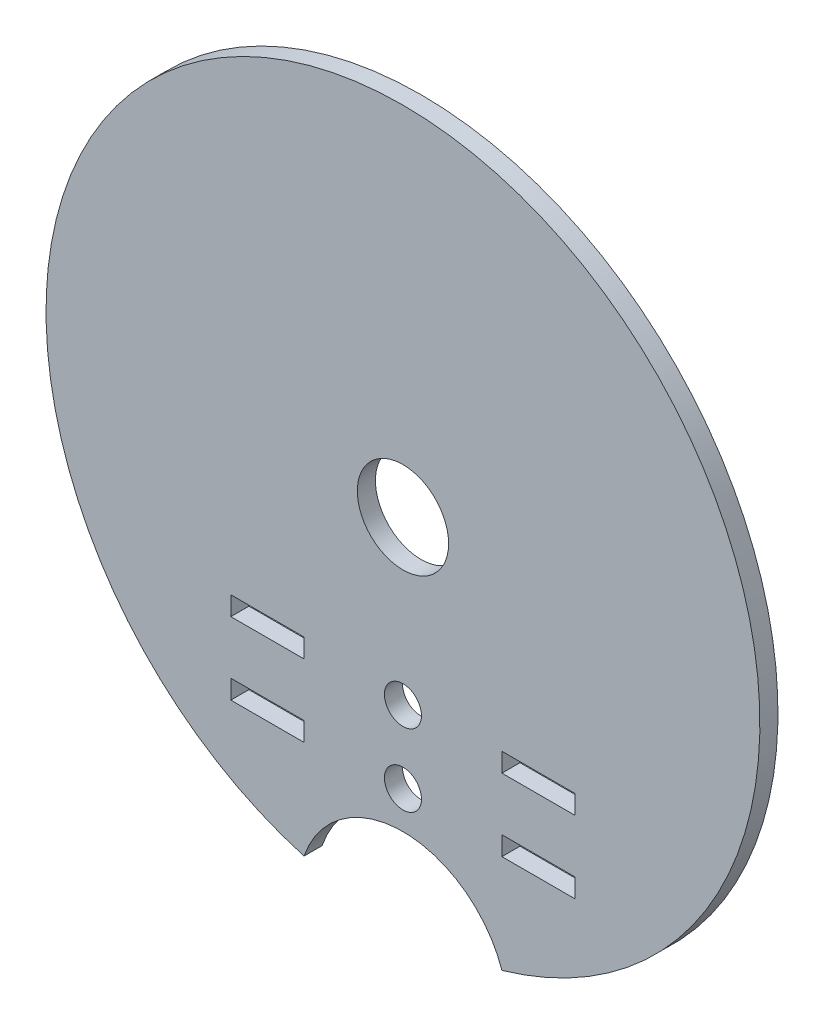
ISO-10303-21;
HEADER;
FILE_DESCRIPTION(('STEP AP214'),'2;1');
FILE_NAME('part.step','',(''),(''),'','','');
FILE_SCHEMA(('AUTOMOTIVE_DESIGN { 1 0 10303 214 1 1 1 1 }'));
ENDSEC;
DATA;
#1=APPLICATION_CONTEXT('core data for automotive mechanical design processes');
#2=APPLICATION_PROTOCOL_DEFINITION('international standard','automotive_design',2000,#1);
#3=PRODUCT_CONTEXT('',#1,'mechanical');
#4=PRODUCT('Part','Part','',(#3));
#5=PRODUCT_RELATED_PRODUCT_CATEGORY('part','',(#4));
#6=PRODUCT_DEFINITION_FORMATION('','',#4);
#7=PRODUCT_DEFINITION_CONTEXT('part definition',#1,'design');
#8=PRODUCT_DEFINITION('design','',#6,#7);
#9=PRODUCT_DEFINITION_SHAPE('','',#8);
#10=(LENGTH_UNIT() NAMED_UNIT(*) SI_UNIT(.MILLI.,.METRE.));
#11=(NAMED_UNIT(*) PLANE_ANGLE_UNIT() SI_UNIT($,.RADIAN.));
#12=(NAMED_UNIT(*) SI_UNIT($,.STERADIAN.) SOLID_ANGLE_UNIT());
#13=UNCERTAINTY_MEASURE_WITH_UNIT(LENGTH_MEASURE(1.E-05),#10,'distance_accuracy_value','');
#14=(GEOMETRIC_REPRESENTATION_CONTEXT(3) GLOBAL_UNCERTAINTY_ASSIGNED_CONTEXT((#13)) GLOBAL_UNIT_ASSIGNED_CONTEXT((#10,
#11,#12)) REPRESENTATION_CONTEXT('',''));
#15=CARTESIAN_POINT('',(0.,0.,0.));
#16=DIRECTION('',(0.,0.,1.));
#17=DIRECTION('',(1.,0.,0.));
#18=AXIS2_PLACEMENT_3D('',#15,#16,#17);
#19=CARTESIAN_POINT('',(0.,5.1515428751664,2.));
#20=DIRECTION('',(0.,0.,-1.));
#21=DIRECTION('',(-1.,0.,0.));
#22=AXIS2_PLACEMENT_3D('',#19,#20,#21);
#23=PLANE('',#22);
#24=DIRECTION('',(-1.,0.,0.));
#25=VECTOR('',#24,1.);
#26=CARTESIAN_POINT('',(19.05,9.05,2.));
#27=LINE('',#26,#25);
#28=CARTESIAN_POINT('',(19.05,9.05,2.));
#29=VERTEX_POINT('',#28);
#30=CARTESIAN_POINT('',(10.95,9.05,2.));
#31=VERTEX_POINT('',#30);
#32=EDGE_CURVE('E216',#29,#31,#27,.T.);
#33=ORIENTED_EDGE('',*,*,#32,.F.);
#34=DIRECTION('',(0.,1.,0.));
#35=VECTOR('',#34,1.);
#36=CARTESIAN_POINT('',(19.05,9.05,2.));
#37=LINE('',#36,#35);
#38=CARTESIAN_POINT('',(19.05,6.95,2.));
#39=VERTEX_POINT('',#38);
#40=EDGE_CURVE('E227',#39,#29,#37,.T.);
#41=ORIENTED_EDGE('',*,*,#40,.F.);
#42=DIRECTION('',(1.,0.,0.));
#43=VECTOR('',#42,1.);
#44=CARTESIAN_POINT('',(19.05,6.95,2.));
#45=LINE('',#44,#43);
#46=CARTESIAN_POINT('',(10.95,6.95,2.));
#47=VERTEX_POINT('',#46);
#48=EDGE_CURVE('E223',#47,#39,#45,.T.);
#49=ORIENTED_EDGE('',*,*,#48,.F.);
#50=DIRECTION('',(0.,-1.,0.));
#51=VECTOR('',#50,1.);
#52=CARTESIAN_POINT('',(10.95,9.05,2.));
#53=LINE('',#52,#51);
#54=EDGE_CURVE('E219',#31,#47,#53,.T.);
#55=ORIENTED_EDGE('',*,*,#54,.F.);
#56=EDGE_LOOP('',(#33,#41,#49,#55));
#57=FACE_BOUND('',#56,.T.);
#58=DIRECTION('',(0.,1.,0.));
#59=VECTOR('',#58,1.);
#60=CARTESIAN_POINT('',(-10.95,9.05,2.));
#61=LINE('',#60,#59);
#62=CARTESIAN_POINT('',(-10.95,6.95,2.));
#63=VERTEX_POINT('',#62);
#64=CARTESIAN_POINT('',(-10.95,9.05,2.));
#65=VERTEX_POINT('',#64);
#66=EDGE_CURVE('E302',#63,#65,#61,.T.);
#67=ORIENTED_EDGE('',*,*,#66,.F.);
#68=DIRECTION('',(1.,0.,0.));
#69=VECTOR('',#68,1.);
#70=CARTESIAN_POINT('',(-19.05,6.95,2.));
#71=LINE('',#70,#69);
#72=CARTESIAN_POINT('',(-19.05,6.95,2.));
#73=VERTEX_POINT('',#72);
#74=EDGE_CURVE('E313',#73,#63,#71,.T.);
#75=ORIENTED_EDGE('',*,*,#74,.F.);
#76=DIRECTION('',(0.,-1.,0.));
#77=VECTOR('',#76,1.);
#78=CARTESIAN_POINT('',(-19.05,9.05,2.));
#79=LINE('',#78,#77);
#80=CARTESIAN_POINT('',(-19.05,9.05,2.));
#81=VERTEX_POINT('',#80);
#82=EDGE_CURVE('E309',#81,#73,#79,.T.);
#83=ORIENTED_EDGE('',*,*,#82,.F.);
#84=DIRECTION('',(-1.,0.,0.));
#85=VECTOR('',#84,1.);
#86=CARTESIAN_POINT('',(-19.05,9.05,2.));
#87=LINE('',#86,#85);
#88=EDGE_CURVE('E305',#65,#81,#87,.T.);
#89=ORIENTED_EDGE('',*,*,#88,.F.);
#90=EDGE_LOOP('',(#67,#75,#83,#89));
#91=FACE_BOUND('',#90,.T.);
#92=CARTESIAN_POINT('',(0.,26.,2.));
#93=DIRECTION('',(0.,0.,1.));
#94=DIRECTION('',(-1.,0.,0.));
#95=AXIS2_PLACEMENT_3D('',#92,#93,#94);
#96=CIRCLE('',#95,39.5);
#97=CARTESIAN_POINT('',(10.95,-11.9519103603495,2.));
#98=VERTEX_POINT('',#97);
#99=CARTESIAN_POINT('',(-10.95,-11.9519103603495,2.));
#100=VERTEX_POINT('',#99);
#101=EDGE_CURVE('E361',#98,#100,#96,.T.);
#102=ORIENTED_EDGE('',*,*,#101,.T.);
#103=CARTESIAN_POINT('',(0.,-15.6969142496672,2.));
#104=DIRECTION('',(0.,0.,-1.));
#105=DIRECTION('',(-1.,0.,0.));
#106=AXIS2_PLACEMENT_3D('',#103,#104,#105);
#107=CIRCLE('',#106,11.5727072947951);
#108=EDGE_CURVE('E365',#100,#98,#107,.T.);
#109=ORIENTED_EDGE('',*,*,#108,.T.);
#110=EDGE_LOOP('',(#102,#109));
#111=FACE_BOUND('',#110,.T.);
#112=CARTESIAN_POINT('',(0.,0.,2.));
#113=DIRECTION('',(0.,0.,1.));
#114=DIRECTION('',(1.,0.,0.));
#115=AXIS2_PLACEMENT_3D('',#112,#113,#114);
#116=CIRCLE('',#115,2.05);
#117=CARTESIAN_POINT('',(2.05,0.,2.));
#118=VERTEX_POINT('',#117);
#119=EDGE_CURVE('E353',#118,#118,#116,.T.);
#120=ORIENTED_EDGE('',*,*,#119,.F.);
#121=EDGE_LOOP('',(#120));
#122=FACE_BOUND('',#121,.T.);
#123=CARTESIAN_POINT('',(0.,8.,2.));
#124=DIRECTION('',(0.,0.,1.));
#125=DIRECTION('',(1.,0.,0.));
#126=AXIS2_PLACEMENT_3D('',#123,#124,#125);
#127=CIRCLE('',#126,2.05);
#128=CARTESIAN_POINT('',(2.05,8.,2.));
#129=VERTEX_POINT('',#128);
#130=EDGE_CURVE('E345',#129,#129,#127,.T.);
#131=ORIENTED_EDGE('',*,*,#130,.F.);
#132=EDGE_LOOP('',(#131));
#133=FACE_BOUND('',#132,.T.);
#134=DIRECTION('',(1.,0.,0.));
#135=VECTOR('',#134,1.);
#136=CARTESIAN_POINT('',(-19.05,-1.05,2.));
#137=LINE('',#136,#135);
#138=CARTESIAN_POINT('',(-19.05,-1.05,2.));
#139=VERTEX_POINT('',#138);
#140=CARTESIAN_POINT('',(-10.95,-1.05,2.));
#141=VERTEX_POINT('',#140);
#142=EDGE_CURVE('E259',#139,#141,#137,.T.);
#143=ORIENTED_EDGE('',*,*,#142,.F.);
#144=DIRECTION('',(0.,-1.,0.));
#145=VECTOR('',#144,1.);
#146=CARTESIAN_POINT('',(-19.05,-1.05,2.));
#147=LINE('',#146,#145);
#148=CARTESIAN_POINT('',(-19.05,1.05,2.));
#149=VERTEX_POINT('',#148);
#150=EDGE_CURVE('E270',#149,#139,#147,.T.);
#151=ORIENTED_EDGE('',*,*,#150,.F.);
#152=DIRECTION('',(-1.,0.,0.));
#153=VECTOR('',#152,1.);
#154=CARTESIAN_POINT('',(-19.05,1.05,2.));
#155=LINE('',#154,#153);
#156=CARTESIAN_POINT('',(-10.95,1.05,2.));
#157=VERTEX_POINT('',#156);
#158=EDGE_CURVE('E266',#157,#149,#155,.T.);
#159=ORIENTED_EDGE('',*,*,#158,.F.);
#160=DIRECTION('',(0.,1.,0.));
#161=VECTOR('',#160,1.);
#162=CARTESIAN_POINT('',(-10.95,-1.05,2.));
#163=LINE('',#162,#161);
#164=EDGE_CURVE('E262',#141,#157,#163,.T.);
#165=ORIENTED_EDGE('',*,*,#164,.F.);
#166=EDGE_LOOP('',(#143,#151,#159,#165));
#167=FACE_BOUND('',#166,.T.);
#168=DIRECTION('',(0.,1.,0.));
#169=VECTOR('',#168,1.);
#170=CARTESIAN_POINT('',(19.05,-1.05,2.));
#171=LINE('',#170,#169);
#172=CARTESIAN_POINT('',(19.05,-1.05,2.));
#173=VERTEX_POINT('',#172);
#174=CARTESIAN_POINT('',(19.05,1.05,2.));
#175=VERTEX_POINT('',#174);
#176=EDGE_CURVE('E165',#173,#175,#171,.T.);
#177=ORIENTED_EDGE('',*,*,#176,.F.);
#178=DIRECTION('',(1.,0.,0.));
#179=VECTOR('',#178,1.);
#180=CARTESIAN_POINT('',(19.05,-1.05,2.));
#181=LINE('',#180,#179);
#182=CARTESIAN_POINT('',(10.95,-1.05,2.));
#183=VERTEX_POINT('',#182);
#184=EDGE_CURVE('E192',#183,#173,#181,.T.);
#185=ORIENTED_EDGE('',*,*,#184,.F.);
#186=DIRECTION('',(0.,-1.,0.));
#187=VECTOR('',#186,1.);
#188=CARTESIAN_POINT('',(10.95,-1.05,2.));
#189=LINE('',#188,#187);
#190=CARTESIAN_POINT('',(10.95,1.05,2.));
#191=VERTEX_POINT('',#190);
#192=EDGE_CURVE('E188',#191,#183,#189,.T.);
#193=ORIENTED_EDGE('',*,*,#192,.F.);
#194=DIRECTION('',(-1.,0.,0.));
#195=VECTOR('',#194,1.);
#196=CARTESIAN_POINT('',(19.05,1.05,2.));
#197=LINE('',#196,#195);
#198=EDGE_CURVE('E174',#175,#191,#197,.T.);
#199=ORIENTED_EDGE('',*,*,#198,.F.);
#200=EDGE_LOOP('',(#177,#185,#193,#199));
#201=FACE_BOUND('',#200,.T.);
#202=CARTESIAN_POINT('',(0.,26.,2.));
#203=DIRECTION('',(0.,0.,1.));
#204=DIRECTION('',(1.,0.,0.));
#205=AXIS2_PLACEMENT_3D('',#202,#203,#204);
#206=CIRCLE('',#205,5.05);
#207=CARTESIAN_POINT('',(5.05,26.,2.));
#208=VERTEX_POINT('',#207);
#209=EDGE_CURVE('E200',#208,#208,#206,.T.);
#210=ORIENTED_EDGE('',*,*,#209,.F.);
#211=EDGE_LOOP('',(#210));
#212=FACE_BOUND('',#211,.T.);
#213=ADVANCED_FACE('F39',(#57,#91,#111,#122,#133,#167,#201,#212),#23,.F.);
#214=CARTESIAN_POINT('',(0.,5.1515428751664,0.));
#215=DIRECTION('',(0.,0.,-1.));
#216=DIRECTION('',(-1.,0.,0.));
#217=AXIS2_PLACEMENT_3D('',#214,#215,#216);
#218=PLANE('',#217);
#219=DIRECTION('',(1.,0.,0.));
#220=VECTOR('',#219,1.);
#221=CARTESIAN_POINT('',(19.05,-1.05,0.));
#222=LINE('',#221,#220);
#223=CARTESIAN_POINT('',(10.95,-1.05,0.));
#224=VERTEX_POINT('',#223);
#225=CARTESIAN_POINT('',(19.05,-1.05,0.));
#226=VERTEX_POINT('',#225);
#227=EDGE_CURVE('E175',#224,#226,#222,.T.);
#228=ORIENTED_EDGE('',*,*,#227,.T.);
#229=DIRECTION('',(0.,1.,0.));
#230=VECTOR('',#229,1.);
#231=CARTESIAN_POINT('',(19.05,-1.05,0.));
#232=LINE('',#231,#230);
#233=CARTESIAN_POINT('',(19.05,1.05,0.));
#234=VERTEX_POINT('',#233);
#235=EDGE_CURVE('E63',#226,#234,#232,.T.);
#236=ORIENTED_EDGE('',*,*,#235,.T.);
#237=DIRECTION('',(-1.,0.,0.));
#238=VECTOR('',#237,1.);
#239=CARTESIAN_POINT('',(19.05,1.05,0.));
#240=LINE('',#239,#238);
#241=CARTESIAN_POINT('',(10.95,1.05,0.));
#242=VERTEX_POINT('',#241);
#243=EDGE_CURVE('E181',#234,#242,#240,.T.);
#244=ORIENTED_EDGE('',*,*,#243,.T.);
#245=DIRECTION('',(0.,-1.,0.));
#246=VECTOR('',#245,1.);
#247=CARTESIAN_POINT('',(10.95,-1.05,0.));
#248=LINE('',#247,#246);
#249=EDGE_CURVE('E203',#242,#224,#248,.T.);
#250=ORIENTED_EDGE('',*,*,#249,.T.);
#251=EDGE_LOOP('',(#228,#236,#244,#250));
#252=FACE_BOUND('',#251,.T.);
#253=DIRECTION('',(0.,1.,0.));
#254=VECTOR('',#253,1.);
#255=CARTESIAN_POINT('',(19.05,9.05,0.));
#256=LINE('',#255,#254);
#257=CARTESIAN_POINT('',(19.05,6.95,0.));
#258=VERTEX_POINT('',#257);
#259=CARTESIAN_POINT('',(19.05,9.05,0.));
#260=VERTEX_POINT('',#259);
#261=EDGE_CURVE('E220',#258,#260,#256,.T.);
#262=ORIENTED_EDGE('',*,*,#261,.T.);
#263=DIRECTION('',(-1.,0.,0.));
#264=VECTOR('',#263,1.);
#265=CARTESIAN_POINT('',(19.05,9.05,0.));
#266=LINE('',#265,#264);
#267=CARTESIAN_POINT('',(10.95,9.05,0.));
#268=VERTEX_POINT('',#267);
#269=EDGE_CURVE('E183',#260,#268,#266,.T.);
#270=ORIENTED_EDGE('',*,*,#269,.T.);
#271=DIRECTION('',(0.,-1.,0.));
#272=VECTOR('',#271,1.);
#273=CARTESIAN_POINT('',(10.95,9.05,0.));
#274=LINE('',#273,#272);
#275=CARTESIAN_POINT('',(10.95,6.95,0.));
#276=VERTEX_POINT('',#275);
#277=EDGE_CURVE('E234',#268,#276,#274,.T.);
#278=ORIENTED_EDGE('',*,*,#277,.T.);
#279=DIRECTION('',(1.,0.,0.));
#280=VECTOR('',#279,1.);
#281=CARTESIAN_POINT('',(19.05,6.95,0.));
#282=LINE('',#281,#280);
#283=EDGE_CURVE('E238',#276,#258,#282,.T.);
#284=ORIENTED_EDGE('',*,*,#283,.T.);
#285=EDGE_LOOP('',(#262,#270,#278,#284));
#286=FACE_BOUND('',#285,.T.);
#287=DIRECTION('',(0.,-1.,0.));
#288=VECTOR('',#287,1.);
#289=CARTESIAN_POINT('',(-19.05,-1.05,0.));
#290=LINE('',#289,#288);
#291=CARTESIAN_POINT('',(-19.05,1.05,0.));
#292=VERTEX_POINT('',#291);
#293=CARTESIAN_POINT('',(-19.05,-1.05,0.));
#294=VERTEX_POINT('',#293);
#295=EDGE_CURVE('E263',#292,#294,#290,.T.);
#296=ORIENTED_EDGE('',*,*,#295,.T.);
#297=DIRECTION('',(1.,0.,0.));
#298=VECTOR('',#297,1.);
#299=CARTESIAN_POINT('',(-19.05,-1.05,0.));
#300=LINE('',#299,#298);
#301=CARTESIAN_POINT('',(-10.95,-1.05,0.));
#302=VERTEX_POINT('',#301);
#303=EDGE_CURVE('E258',#294,#302,#300,.T.);
#304=ORIENTED_EDGE('',*,*,#303,.T.);
#305=DIRECTION('',(0.,1.,0.));
#306=VECTOR('',#305,1.);
#307=CARTESIAN_POINT('',(-10.95,-1.05,0.));
#308=LINE('',#307,#306);
#309=CARTESIAN_POINT('',(-10.95,1.05,0.));
#310=VERTEX_POINT('',#309);
#311=EDGE_CURVE('E277',#302,#310,#308,.T.);
#312=ORIENTED_EDGE('',*,*,#311,.T.);
#313=DIRECTION('',(-1.,0.,0.));
#314=VECTOR('',#313,1.);
#315=CARTESIAN_POINT('',(-19.05,1.05,0.));
#316=LINE('',#315,#314);
#317=EDGE_CURVE('E281',#310,#292,#316,.T.);
#318=ORIENTED_EDGE('',*,*,#317,.T.);
#319=EDGE_LOOP('',(#296,#304,#312,#318));
#320=FACE_BOUND('',#319,.T.);
#321=DIRECTION('',(1.,0.,0.));
#322=VECTOR('',#321,1.);
#323=CARTESIAN_POINT('',(-19.05,6.95,0.));
#324=LINE('',#323,#322);
#325=CARTESIAN_POINT('',(-19.05,6.95,0.));
#326=VERTEX_POINT('',#325);
#327=CARTESIAN_POINT('',(-10.95,6.95,0.));
#328=VERTEX_POINT('',#327);
#329=EDGE_CURVE('E306',#326,#328,#324,.T.);
#330=ORIENTED_EDGE('',*,*,#329,.T.);
#331=DIRECTION('',(0.,1.,0.));
#332=VECTOR('',#331,1.);
#333=CARTESIAN_POINT('',(-10.95,9.05,0.));
#334=LINE('',#333,#332);
#335=CARTESIAN_POINT('',(-10.95,9.05,0.));
#336=VERTEX_POINT('',#335);
#337=EDGE_CURVE('E301',#328,#336,#334,.T.);
#338=ORIENTED_EDGE('',*,*,#337,.T.);
#339=DIRECTION('',(-1.,0.,0.));
#340=VECTOR('',#339,1.);
#341=CARTESIAN_POINT('',(-19.05,9.05,0.));
#342=LINE('',#341,#340);
#343=CARTESIAN_POINT('',(-19.05,9.05,0.));
#344=VERTEX_POINT('',#343);
#345=EDGE_CURVE('E320',#336,#344,#342,.T.);
#346=ORIENTED_EDGE('',*,*,#345,.T.);
#347=DIRECTION('',(0.,-1.,0.));
#348=VECTOR('',#347,1.);
#349=CARTESIAN_POINT('',(-19.05,9.05,0.));
#350=LINE('',#349,#348);
#351=EDGE_CURVE('E324',#344,#326,#350,.T.);
#352=ORIENTED_EDGE('',*,*,#351,.T.);
#353=EDGE_LOOP('',(#330,#338,#346,#352));
#354=FACE_BOUND('',#353,.T.);
#355=CARTESIAN_POINT('',(0.,8.,0.));
#356=DIRECTION('',(0.,0.,1.));
#357=DIRECTION('',(1.,0.,0.));
#358=AXIS2_PLACEMENT_3D('',#355,#356,#357);
#359=CIRCLE('',#358,2.05);
#360=CARTESIAN_POINT('',(2.05,8.,0.));
#361=VERTEX_POINT('',#360);
#362=EDGE_CURVE('E344',#361,#361,#359,.T.);
#363=ORIENTED_EDGE('',*,*,#362,.T.);
#364=EDGE_LOOP('',(#363));
#365=FACE_BOUND('',#364,.T.);
#366=CARTESIAN_POINT('',(0.,26.,0.));
#367=DIRECTION('',(0.,0.,1.));
#368=DIRECTION('',(-1.,0.,0.));
#369=AXIS2_PLACEMENT_3D('',#366,#367,#368);
#370=CIRCLE('',#369,39.5);
#371=CARTESIAN_POINT('',(10.95,-11.9519103603495,0.));
#372=VERTEX_POINT('',#371);
#373=CARTESIAN_POINT('',(-10.95,-11.9519103603495,0.));
#374=VERTEX_POINT('',#373);
#375=EDGE_CURVE('E357',#372,#374,#370,.T.);
#376=ORIENTED_EDGE('',*,*,#375,.F.);
#377=CARTESIAN_POINT('',(0.,-15.6969142496672,0.));
#378=DIRECTION('',(0.,0.,-1.));
#379=DIRECTION('',(-1.,0.,0.));
#380=AXIS2_PLACEMENT_3D('',#377,#378,#379);
#381=CIRCLE('',#380,11.5727072947951);
#382=EDGE_CURVE('E366',#374,#372,#381,.T.);
#383=ORIENTED_EDGE('',*,*,#382,.F.);
#384=EDGE_LOOP('',(#376,#383));
#385=FACE_BOUND('',#384,.T.);
#386=CARTESIAN_POINT('',(0.,0.,0.));
#387=DIRECTION('',(0.,0.,1.));
#388=DIRECTION('',(1.,0.,0.));
#389=AXIS2_PLACEMENT_3D('',#386,#387,#388);
#390=CIRCLE('',#389,2.05);
#391=CARTESIAN_POINT('',(2.05,0.,0.));
#392=VERTEX_POINT('',#391);
#393=EDGE_CURVE('E349',#392,#392,#390,.T.);
#394=ORIENTED_EDGE('',*,*,#393,.T.);
#395=EDGE_LOOP('',(#394));
#396=FACE_BOUND('',#395,.T.);
#397=CARTESIAN_POINT('',(0.,26.,0.));
#398=DIRECTION('',(0.,0.,1.));
#399=DIRECTION('',(1.,0.,0.));
#400=AXIS2_PLACEMENT_3D('',#397,#398,#399);
#401=CIRCLE('',#400,5.05);
#402=CARTESIAN_POINT('',(5.05,26.,0.));
#403=VERTEX_POINT('',#402);
#404=EDGE_CURVE('E616',#403,#403,#401,.T.);
#405=ORIENTED_EDGE('',*,*,#404,.T.);
#406=EDGE_LOOP('',(#405));
#407=FACE_BOUND('',#406,.T.);
#408=ADVANCED_FACE('F382',(#252,#286,#320,#354,#365,#385,#396,#407),#218,.T.);
#409=CARTESIAN_POINT('',(0.,26.,2.));
#410=DIRECTION('',(0.,0.,-1.));
#411=DIRECTION('',(-1.,0.,0.));
#412=AXIS2_PLACEMENT_3D('',#409,#410,#411);
#413=CYLINDRICAL_SURFACE('',#412,39.5);
#414=ORIENTED_EDGE('',*,*,#375,.T.);
#415=DIRECTION('',(0.,0.,-1.));
#416=VECTOR('',#415,1.);
#417=CARTESIAN_POINT('',(-10.95,-11.9519103603495,2.));
#418=LINE('',#417,#416);
#419=EDGE_CURVE('E11',#100,#374,#418,.T.);
#420=ORIENTED_EDGE('',*,*,#419,.F.);
#421=ORIENTED_EDGE('',*,*,#101,.F.);
#422=DIRECTION('',(0.,0.,-1.));
#423=VECTOR('',#422,1.);
#424=CARTESIAN_POINT('',(10.95,-11.9519103603495,2.));
#425=LINE('',#424,#423);
#426=EDGE_CURVE('E48',#98,#372,#425,.T.);
#427=ORIENTED_EDGE('',*,*,#426,.T.);
#428=EDGE_LOOP('',(#414,#420,#421,#427));
#429=FACE_BOUND('',#428,.T.);
#430=ADVANCED_FACE('F41',(#429),#413,.T.);
#431=CARTESIAN_POINT('',(0.,-15.6969142496672,2.));
#432=DIRECTION('',(0.,0.,-1.));
#433=DIRECTION('',(-1.,0.,0.));
#434=AXIS2_PLACEMENT_3D('',#431,#432,#433);
#435=CYLINDRICAL_SURFACE('',#434,11.5727072947951);
#436=ORIENTED_EDGE('',*,*,#382,.T.);
#437=ORIENTED_EDGE('',*,*,#426,.F.);
#438=ORIENTED_EDGE('',*,*,#108,.F.);
#439=ORIENTED_EDGE('',*,*,#419,.T.);
#440=EDGE_LOOP('',(#436,#437,#438,#439));
#441=FACE_BOUND('',#440,.T.);
#442=ADVANCED_FACE('F384',(#441),#435,.F.);
#443=CARTESIAN_POINT('',(0.,0.,2.));
#444=DIRECTION('',(0.,0.,-1.));
#445=DIRECTION('',(-1.,0.,0.));
#446=AXIS2_PLACEMENT_3D('',#443,#444,#445);
#447=CYLINDRICAL_SURFACE('',#446,2.05);
#448=ORIENTED_EDGE('',*,*,#119,.T.);
#449=EDGE_LOOP('',(#448));
#450=FACE_BOUND('',#449,.T.);
#451=ORIENTED_EDGE('',*,*,#393,.F.);
#452=EDGE_LOOP('',(#451));
#453=FACE_BOUND('',#452,.T.);
#454=ADVANCED_FACE('F445',(#450,#453),#447,.F.);
#455=CARTESIAN_POINT('',(0.,8.,2.));
#456=DIRECTION('',(0.,0.,-1.));
#457=DIRECTION('',(-1.,0.,0.));
#458=AXIS2_PLACEMENT_3D('',#455,#456,#457);
#459=CYLINDRICAL_SURFACE('',#458,2.05);
#460=ORIENTED_EDGE('',*,*,#130,.T.);
#461=EDGE_LOOP('',(#460));
#462=FACE_BOUND('',#461,.T.);
#463=ORIENTED_EDGE('',*,*,#362,.F.);
#464=EDGE_LOOP('',(#463));
#465=FACE_BOUND('',#464,.T.);
#466=ADVANCED_FACE('F441',(#462,#465),#459,.F.);
#467=CARTESIAN_POINT('',(-10.95,9.05,2.));
#468=DIRECTION('',(-1.,0.,0.));
#469=DIRECTION('',(0.,0.,1.));
#470=AXIS2_PLACEMENT_3D('',#467,#468,#469);
#471=PLANE('',#470);
#472=ORIENTED_EDGE('',*,*,#337,.F.);
#473=DIRECTION('',(0.,0.,-1.));
#474=VECTOR('',#473,1.);
#475=CARTESIAN_POINT('',(-10.95,6.95,2.));
#476=LINE('',#475,#474);
#477=EDGE_CURVE('E316',#63,#328,#476,.T.);
#478=ORIENTED_EDGE('',*,*,#477,.F.);
#479=ORIENTED_EDGE('',*,*,#66,.T.);
#480=DIRECTION('',(0.,0.,-1.));
#481=VECTOR('',#480,1.);
#482=CARTESIAN_POINT('',(-10.95,9.05,2.));
#483=LINE('',#482,#481);
#484=EDGE_CURVE('E340',#65,#336,#483,.T.);
#485=ORIENTED_EDGE('',*,*,#484,.T.);
#486=EDGE_LOOP('',(#472,#478,#479,#485));
#487=FACE_BOUND('',#486,.T.);
#488=ADVANCED_FACE('F437',(#487),#471,.T.);
#489=CARTESIAN_POINT('',(-19.05,9.05,2.));
#490=DIRECTION('',(0.,-1.,0.));
#491=DIRECTION('',(0.,0.,-1.));
#492=AXIS2_PLACEMENT_3D('',#489,#490,#491);
#493=PLANE('',#492);
#494=ORIENTED_EDGE('',*,*,#345,.F.);
#495=ORIENTED_EDGE('',*,*,#484,.F.);
#496=ORIENTED_EDGE('',*,*,#88,.T.);
#497=DIRECTION('',(0.,0.,-1.));
#498=VECTOR('',#497,1.);
#499=CARTESIAN_POINT('',(-19.05,9.05,2.));
#500=LINE('',#499,#498);
#501=EDGE_CURVE('E337',#81,#344,#500,.T.);
#502=ORIENTED_EDGE('',*,*,#501,.T.);
#503=EDGE_LOOP('',(#494,#495,#496,#502));
#504=FACE_BOUND('',#503,.T.);
#505=ADVANCED_FACE('F433',(#504),#493,.T.);
#506=CARTESIAN_POINT('',(-19.05,9.05,2.));
#507=DIRECTION('',(1.,0.,0.));
#508=DIRECTION('',(0.,0.,-1.));
#509=AXIS2_PLACEMENT_3D('',#506,#507,#508);
#510=PLANE('',#509);
#511=ORIENTED_EDGE('',*,*,#351,.F.);
#512=ORIENTED_EDGE('',*,*,#501,.F.);
#513=ORIENTED_EDGE('',*,*,#82,.T.);
#514=DIRECTION('',(0.,0.,-1.));
#515=VECTOR('',#514,1.);
#516=CARTESIAN_POINT('',(-19.05,6.95,2.));
#517=LINE('',#516,#515);
#518=EDGE_CURVE('E334',#73,#326,#517,.T.);
#519=ORIENTED_EDGE('',*,*,#518,.T.);
#520=EDGE_LOOP('',(#511,#512,#513,#519));
#521=FACE_BOUND('',#520,.T.);
#522=ADVANCED_FACE('F429',(#521),#510,.T.);
#523=CARTESIAN_POINT('',(-19.05,6.95,2.));
#524=DIRECTION('',(0.,1.,0.));
#525=DIRECTION('',(0.,0.,1.));
#526=AXIS2_PLACEMENT_3D('',#523,#524,#525);
#527=PLANE('',#526);
#528=ORIENTED_EDGE('',*,*,#329,.F.);
#529=ORIENTED_EDGE('',*,*,#518,.F.);
#530=ORIENTED_EDGE('',*,*,#74,.T.);
#531=ORIENTED_EDGE('',*,*,#477,.T.);
#532=EDGE_LOOP('',(#528,#529,#530,#531));
#533=FACE_BOUND('',#532,.T.);
#534=ADVANCED_FACE('F426',(#533),#527,.T.);
#535=CARTESIAN_POINT('',(-19.05,-1.05,2.));
#536=DIRECTION('',(0.,1.,0.));
#537=DIRECTION('',(0.,0.,1.));
#538=AXIS2_PLACEMENT_3D('',#535,#536,#537);
#539=PLANE('',#538);
#540=ORIENTED_EDGE('',*,*,#303,.F.);
#541=DIRECTION('',(0.,0.,-1.));
#542=VECTOR('',#541,1.);
#543=CARTESIAN_POINT('',(-19.05,-1.05,2.));
#544=LINE('',#543,#542);
#545=EDGE_CURVE('E273',#139,#294,#544,.T.);
#546=ORIENTED_EDGE('',*,*,#545,.F.);
#547=ORIENTED_EDGE('',*,*,#142,.T.);
#548=DIRECTION('',(0.,0.,-1.));
#549=VECTOR('',#548,1.);
#550=CARTESIAN_POINT('',(-10.95,-1.05,2.));
#551=LINE('',#550,#549);
#552=EDGE_CURVE('E297',#141,#302,#551,.T.);
#553=ORIENTED_EDGE('',*,*,#552,.T.);
#554=EDGE_LOOP('',(#540,#546,#547,#553));
#555=FACE_BOUND('',#554,.T.);
#556=ADVANCED_FACE('F401',(#555),#539,.T.);
#557=CARTESIAN_POINT('',(-10.95,-1.05,2.));
#558=DIRECTION('',(-1.,0.,0.));
#559=DIRECTION('',(0.,0.,1.));
#560=AXIS2_PLACEMENT_3D('',#557,#558,#559);
#561=PLANE('',#560);
#562=ORIENTED_EDGE('',*,*,#311,.F.);
#563=ORIENTED_EDGE('',*,*,#552,.F.);
#564=ORIENTED_EDGE('',*,*,#164,.T.);
#565=DIRECTION('',(0.,0.,-1.));
#566=VECTOR('',#565,1.);
#567=CARTESIAN_POINT('',(-10.95,1.05,2.));
#568=LINE('',#567,#566);
#569=EDGE_CURVE('E294',#157,#310,#568,.T.);
#570=ORIENTED_EDGE('',*,*,#569,.T.);
#571=EDGE_LOOP('',(#562,#563,#564,#570));
#572=FACE_BOUND('',#571,.T.);
#573=ADVANCED_FACE('F403',(#572),#561,.T.);
#574=CARTESIAN_POINT('',(-19.05,1.05,2.));
#575=DIRECTION('',(0.,-1.,0.));
#576=DIRECTION('',(0.,0.,-1.));
#577=AXIS2_PLACEMENT_3D('',#574,#575,#576);
#578=PLANE('',#577);
#579=ORIENTED_EDGE('',*,*,#317,.F.);
#580=ORIENTED_EDGE('',*,*,#569,.F.);
#581=ORIENTED_EDGE('',*,*,#158,.T.);
#582=DIRECTION('',(0.,0.,-1.));
#583=VECTOR('',#582,1.);
#584=CARTESIAN_POINT('',(-19.05,1.05,2.));
#585=LINE('',#584,#583);
#586=EDGE_CURVE('E291',#149,#292,#585,.T.);
#587=ORIENTED_EDGE('',*,*,#586,.T.);
#588=EDGE_LOOP('',(#579,#580,#581,#587));
#589=FACE_BOUND('',#588,.T.);
#590=ADVANCED_FACE('F412',(#589),#578,.T.);
#591=CARTESIAN_POINT('',(-19.05,-1.05,2.));
#592=DIRECTION('',(1.,0.,0.));
#593=DIRECTION('',(0.,0.,-1.));
#594=AXIS2_PLACEMENT_3D('',#591,#592,#593);
#595=PLANE('',#594);
#596=ORIENTED_EDGE('',*,*,#295,.F.);
#597=ORIENTED_EDGE('',*,*,#586,.F.);
#598=ORIENTED_EDGE('',*,*,#150,.T.);
#599=ORIENTED_EDGE('',*,*,#545,.T.);
#600=EDGE_LOOP('',(#596,#597,#598,#599));
#601=FACE_BOUND('',#600,.T.);
#602=ADVANCED_FACE('F410',(#601),#595,.T.);
#603=CARTESIAN_POINT('',(19.05,9.05,2.));
#604=DIRECTION('',(0.,-1.,0.));
#605=DIRECTION('',(0.,0.,-1.));
#606=AXIS2_PLACEMENT_3D('',#603,#604,#605);
#607=PLANE('',#606);
#608=ORIENTED_EDGE('',*,*,#269,.F.);
#609=DIRECTION('',(0.,0.,-1.));
#610=VECTOR('',#609,1.);
#611=CARTESIAN_POINT('',(19.05,9.05,2.));
#612=LINE('',#611,#610);
#613=EDGE_CURVE('E230',#29,#260,#612,.T.);
#614=ORIENTED_EDGE('',*,*,#613,.F.);
#615=ORIENTED_EDGE('',*,*,#32,.T.);
#616=DIRECTION('',(0.,0.,-1.));
#617=VECTOR('',#616,1.);
#618=CARTESIAN_POINT('',(10.95,9.05,2.));
#619=LINE('',#618,#617);
#620=EDGE_CURVE('E254',#31,#268,#619,.T.);
#621=ORIENTED_EDGE('',*,*,#620,.T.);
#622=EDGE_LOOP('',(#608,#614,#615,#621));
#623=FACE_BOUND('',#622,.T.);
#624=ADVANCED_FACE('F419',(#623),#607,.T.);
#625=CARTESIAN_POINT('',(10.95,9.05,2.));
#626=DIRECTION('',(1.,0.,0.));
#627=DIRECTION('',(0.,0.,-1.));
#628=AXIS2_PLACEMENT_3D('',#625,#626,#627);
#629=PLANE('',#628);
#630=ORIENTED_EDGE('',*,*,#277,.F.);
#631=ORIENTED_EDGE('',*,*,#620,.F.);
#632=ORIENTED_EDGE('',*,*,#54,.T.);
#633=DIRECTION('',(0.,0.,-1.));
#634=VECTOR('',#633,1.);
#635=CARTESIAN_POINT('',(10.95,6.95,2.));
#636=LINE('',#635,#634);
#637=EDGE_CURVE('E251',#47,#276,#636,.T.);
#638=ORIENTED_EDGE('',*,*,#637,.T.);
#639=EDGE_LOOP('',(#630,#631,#632,#638));
#640=FACE_BOUND('',#639,.T.);
#641=ADVANCED_FACE('F533',(#640),#629,.T.);
#642=CARTESIAN_POINT('',(19.05,6.95,2.));
#643=DIRECTION('',(0.,1.,0.));
#644=DIRECTION('',(0.,0.,1.));
#645=AXIS2_PLACEMENT_3D('',#642,#643,#644);
#646=PLANE('',#645);
#647=ORIENTED_EDGE('',*,*,#283,.F.);
#648=ORIENTED_EDGE('',*,*,#637,.F.);
#649=ORIENTED_EDGE('',*,*,#48,.T.);
#650=DIRECTION('',(0.,0.,-1.));
#651=VECTOR('',#650,1.);
#652=CARTESIAN_POINT('',(19.05,6.95,2.));
#653=LINE('',#652,#651);
#654=EDGE_CURVE('E248',#39,#258,#653,.T.);
#655=ORIENTED_EDGE('',*,*,#654,.T.);
#656=EDGE_LOOP('',(#647,#648,#649,#655));
#657=FACE_BOUND('',#656,.T.);
#658=ADVANCED_FACE('F541',(#657),#646,.T.);
#659=CARTESIAN_POINT('',(19.05,9.05,2.));
#660=DIRECTION('',(-1.,0.,0.));
#661=DIRECTION('',(0.,0.,1.));
#662=AXIS2_PLACEMENT_3D('',#659,#660,#661);
#663=PLANE('',#662);
#664=ORIENTED_EDGE('',*,*,#261,.F.);
#665=ORIENTED_EDGE('',*,*,#654,.F.);
#666=ORIENTED_EDGE('',*,*,#40,.T.);
#667=ORIENTED_EDGE('',*,*,#613,.T.);
#668=EDGE_LOOP('',(#664,#665,#666,#667));
#669=FACE_BOUND('',#668,.T.);
#670=ADVANCED_FACE('F550',(#669),#663,.T.);
#671=CARTESIAN_POINT('',(19.05,-1.05,2.));
#672=DIRECTION('',(-1.,0.,0.));
#673=DIRECTION('',(0.,0.,1.));
#674=AXIS2_PLACEMENT_3D('',#671,#672,#673);
#675=PLANE('',#674);
#676=ORIENTED_EDGE('',*,*,#235,.F.);
#677=DIRECTION('',(0.,0.,-1.));
#678=VECTOR('',#677,1.);
#679=CARTESIAN_POINT('',(19.05,-1.05,2.));
#680=LINE('',#679,#678);
#681=EDGE_CURVE('E169',#173,#226,#680,.T.);
#682=ORIENTED_EDGE('',*,*,#681,.F.);
#683=ORIENTED_EDGE('',*,*,#176,.T.);
#684=DIRECTION('',(0.,0.,-1.));
#685=VECTOR('',#684,1.);
#686=CARTESIAN_POINT('',(19.05,1.05,2.));
#687=LINE('',#686,#685);
#688=EDGE_CURVE('E168',#175,#234,#687,.T.);
#689=ORIENTED_EDGE('',*,*,#688,.T.);
#690=EDGE_LOOP('',(#676,#682,#683,#689));
#691=FACE_BOUND('',#690,.T.);
#692=ADVANCED_FACE('F167',(#691),#675,.T.);
#693=CARTESIAN_POINT('',(19.05,1.05,2.));
#694=DIRECTION('',(0.,-1.,0.));
#695=DIRECTION('',(0.,0.,-1.));
#696=AXIS2_PLACEMENT_3D('',#693,#694,#695);
#697=PLANE('',#696);
#698=ORIENTED_EDGE('',*,*,#243,.F.);
#699=ORIENTED_EDGE('',*,*,#688,.F.);
#700=ORIENTED_EDGE('',*,*,#198,.T.);
#701=DIRECTION('',(0.,0.,-1.));
#702=VECTOR('',#701,1.);
#703=CARTESIAN_POINT('',(10.95,1.05,2.));
#704=LINE('',#703,#702);
#705=EDGE_CURVE('E184',#191,#242,#704,.T.);
#706=ORIENTED_EDGE('',*,*,#705,.T.);
#707=EDGE_LOOP('',(#698,#699,#700,#706));
#708=FACE_BOUND('',#707,.T.);
#709=ADVANCED_FACE('F178',(#708),#697,.T.);
#710=CARTESIAN_POINT('',(10.95,-1.05,2.));
#711=DIRECTION('',(1.,0.,0.));
#712=DIRECTION('',(0.,0.,-1.));
#713=AXIS2_PLACEMENT_3D('',#710,#711,#712);
#714=PLANE('',#713);
#715=ORIENTED_EDGE('',*,*,#249,.F.);
#716=ORIENTED_EDGE('',*,*,#705,.F.);
#717=ORIENTED_EDGE('',*,*,#192,.T.);
#718=DIRECTION('',(0.,0.,-1.));
#719=VECTOR('',#718,1.);
#720=CARTESIAN_POINT('',(10.95,-1.05,2.));
#721=LINE('',#720,#719);
#722=EDGE_CURVE('E55',#183,#224,#721,.T.);
#723=ORIENTED_EDGE('',*,*,#722,.T.);
#724=EDGE_LOOP('',(#715,#716,#717,#723));
#725=FACE_BOUND('',#724,.T.);
#726=ADVANCED_FACE('F574',(#725),#714,.T.);
#727=CARTESIAN_POINT('',(19.05,-1.05,2.));
#728=DIRECTION('',(0.,1.,0.));
#729=DIRECTION('',(0.,0.,1.));
#730=AXIS2_PLACEMENT_3D('',#727,#728,#729);
#731=PLANE('',#730);
#732=ORIENTED_EDGE('',*,*,#227,.F.);
#733=ORIENTED_EDGE('',*,*,#722,.F.);
#734=ORIENTED_EDGE('',*,*,#184,.T.);
#735=ORIENTED_EDGE('',*,*,#681,.T.);
#736=EDGE_LOOP('',(#732,#733,#734,#735));
#737=FACE_BOUND('',#736,.T.);
#738=ADVANCED_FACE('F582',(#737),#731,.T.);
#739=CARTESIAN_POINT('',(0.,26.,2.));
#740=DIRECTION('',(0.,0.,-1.));
#741=DIRECTION('',(-1.,0.,0.));
#742=AXIS2_PLACEMENT_3D('',#739,#740,#741);
#743=CYLINDRICAL_SURFACE('',#742,5.05);
#744=ORIENTED_EDGE('',*,*,#209,.T.);
#745=EDGE_LOOP('',(#744));
#746=FACE_BOUND('',#745,.T.);
#747=ORIENTED_EDGE('',*,*,#404,.F.);
#748=EDGE_LOOP('',(#747));
#749=FACE_BOUND('',#748,.T.);
#750=ADVANCED_FACE('F591',(#746,#749),#743,.F.);
#751=CLOSED_SHELL('',(#213,#408,#430,#442,#454,#466,#488,#505,#522,#534,#556,#573,#590,#602,
#624,#641,#658,#670,#692,#709,#726,#738,#750));
#752=MANIFOLD_SOLID_BREP('B2',#751);
#753=ADVANCED_BREP_SHAPE_REPRESENTATION('',(#18,#752),#14);
#754=SHAPE_DEFINITION_REPRESENTATION(#9,#753);
ENDSEC;
END-ISO-10303-21;
